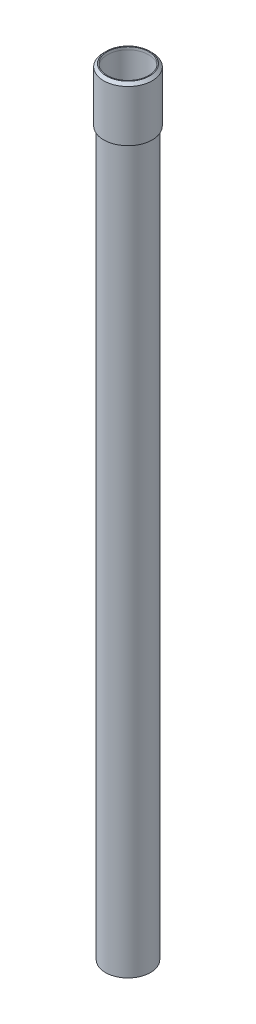
ISO-10303-21;
HEADER;
FILE_DESCRIPTION(('STEP AP214'),'2;1');
FILE_NAME('part.step','',(''),(''),'','','');
FILE_SCHEMA(('AUTOMOTIVE_DESIGN { 1 0 10303 214 1 1 1 1 }'));
ENDSEC;
DATA;
#1=APPLICATION_CONTEXT('core data for automotive mechanical design processes');
#2=APPLICATION_PROTOCOL_DEFINITION('international standard','automotive_design',2000,#1);
#3=PRODUCT_CONTEXT('',#1,'mechanical');
#4=PRODUCT('Part','Part','',(#3));
#5=PRODUCT_RELATED_PRODUCT_CATEGORY('part','',(#4));
#6=PRODUCT_DEFINITION_FORMATION('','',#4);
#7=PRODUCT_DEFINITION_CONTEXT('part definition',#1,'design');
#8=PRODUCT_DEFINITION('design','',#6,#7);
#9=PRODUCT_DEFINITION_SHAPE('','',#8);
#10=(LENGTH_UNIT() NAMED_UNIT(*) SI_UNIT(.MILLI.,.METRE.));
#11=(NAMED_UNIT(*) PLANE_ANGLE_UNIT() SI_UNIT($,.RADIAN.));
#12=(NAMED_UNIT(*) SI_UNIT($,.STERADIAN.) SOLID_ANGLE_UNIT());
#13=UNCERTAINTY_MEASURE_WITH_UNIT(LENGTH_MEASURE(1.E-05),#10,'distance_accuracy_value','');
#14=(GEOMETRIC_REPRESENTATION_CONTEXT(3) GLOBAL_UNCERTAINTY_ASSIGNED_CONTEXT((#13)) GLOBAL_UNIT_ASSIGNED_CONTEXT((#10,
#11,#12)) REPRESENTATION_CONTEXT('',''));
#15=CARTESIAN_POINT('',(0.,0.,0.));
#16=DIRECTION('',(0.,0.,1.));
#17=DIRECTION('',(1.,0.,0.));
#18=AXIS2_PLACEMENT_3D('',#15,#16,#17);
#19=CARTESIAN_POINT('',(0.,224.324804611186,0.));
#20=DIRECTION('',(0.,1.,0.));
#21=DIRECTION('',(0.,0.,1.));
#22=AXIS2_PLACEMENT_3D('',#19,#20,#21);
#23=CYLINDRICAL_SURFACE('',#22,12.5);
#24=CARTESIAN_POINT('',(0.,186.5,0.));
#25=DIRECTION('',(0.,1.,0.));
#26=DIRECTION('',(0.,0.,1.));
#27=AXIS2_PLACEMENT_3D('',#24,#25,#26);
#28=CIRCLE('',#27,12.5);
#29=CARTESIAN_POINT('',(0.,186.5,12.5));
#30=VERTEX_POINT('',#29);
#31=EDGE_CURVE('E52',#30,#30,#28,.T.);
#32=ORIENTED_EDGE('',*,*,#31,.F.);
#33=EDGE_LOOP('',(#32));
#34=FACE_BOUND('',#33,.T.);
#35=CARTESIAN_POINT('',(0.,215.,0.));
#36=DIRECTION('',(0.,1.,0.));
#37=DIRECTION('',(0.,0.,1.));
#38=AXIS2_PLACEMENT_3D('',#35,#36,#37);
#39=CIRCLE('',#38,12.5);
#40=CARTESIAN_POINT('',(0.,215.,12.5));
#41=VERTEX_POINT('',#40);
#42=EDGE_CURVE('E67',#41,#41,#39,.T.);
#43=ORIENTED_EDGE('',*,*,#42,.T.);
#44=EDGE_LOOP('',(#43));
#45=FACE_BOUND('',#44,.T.);
#46=ADVANCED_FACE('F41',(#34,#45),#23,.F.);
#47=CARTESIAN_POINT('',(13.5,186.5,0.));
#48=DIRECTION('',(0.,1.,0.));
#49=DIRECTION('',(0.,0.,1.));
#50=AXIS2_PLACEMENT_3D('',#47,#48,#49);
#51=PLANE('',#50);
#52=CARTESIAN_POINT('',(0.,186.5,0.));
#53=DIRECTION('',(0.,1.,0.));
#54=DIRECTION('',(0.,0.,1.));
#55=AXIS2_PLACEMENT_3D('',#52,#53,#54);
#56=CIRCLE('',#55,13.5);
#57=CARTESIAN_POINT('',(0.,186.5,13.5));
#58=VERTEX_POINT('',#57);
#59=EDGE_CURVE('E56',#58,#58,#56,.T.);
#60=ORIENTED_EDGE('',*,*,#59,.F.);
#61=EDGE_LOOP('',(#60));
#62=FACE_BOUND('',#61,.T.);
#63=ORIENTED_EDGE('',*,*,#31,.T.);
#64=EDGE_LOOP('',(#63));
#65=FACE_BOUND('',#64,.T.);
#66=ADVANCED_FACE('F91',(#62,#65),#51,.F.);
#67=CARTESIAN_POINT('',(0.,224.324804611186,0.));
#68=DIRECTION('',(0.,1.,0.));
#69=DIRECTION('',(0.,0.,1.));
#70=AXIS2_PLACEMENT_3D('',#67,#68,#69);
#71=CYLINDRICAL_SURFACE('',#70,13.5);
#72=CARTESIAN_POINT('',(0.,215.,0.));
#73=DIRECTION('',(0.,-1.,0.));
#74=DIRECTION('',(0.,0.,-1.));
#75=AXIS2_PLACEMENT_3D('',#72,#73,#74);
#76=CIRCLE('',#75,13.5);
#77=CARTESIAN_POINT('',(0.,215.,-13.5));
#78=VERTEX_POINT('',#77);
#79=EDGE_CURVE('E11',#78,#78,#76,.T.);
#80=ORIENTED_EDGE('',*,*,#79,.T.);
#81=EDGE_LOOP('',(#80));
#82=FACE_BOUND('',#81,.T.);
#83=ORIENTED_EDGE('',*,*,#59,.T.);
#84=EDGE_LOOP('',(#83));
#85=FACE_BOUND('',#84,.T.);
#86=ADVANCED_FACE('F86',(#82,#85),#71,.T.);
#87=CARTESIAN_POINT('',(13.5,216.5,0.));
#88=DIRECTION('',(0.,-1.,0.));
#89=DIRECTION('',(0.,0.,-1.));
#90=AXIS2_PLACEMENT_3D('',#87,#88,#89);
#91=PLANE('',#90);
#92=CARTESIAN_POINT('',(0.,216.5,0.));
#93=DIRECTION('',(0.,-1.,0.));
#94=DIRECTION('',(0.,0.,-1.));
#95=AXIS2_PLACEMENT_3D('',#92,#93,#94);
#96=CIRCLE('',#95,12.);
#97=CARTESIAN_POINT('',(0.,216.5,-12.));
#98=VERTEX_POINT('',#97);
#99=EDGE_CURVE('E48',#98,#98,#96,.F.);
#100=ORIENTED_EDGE('',*,*,#99,.T.);
#101=EDGE_LOOP('',(#100));
#102=FACE_BOUND('',#101,.T.);
#103=CARTESIAN_POINT('',(0.,216.5,0.));
#104=DIRECTION('',(0.,1.,0.));
#105=DIRECTION('',(0.,0.,1.));
#106=AXIS2_PLACEMENT_3D('',#103,#104,#105);
#107=CIRCLE('',#106,11.5);
#108=CARTESIAN_POINT('',(0.,216.5,11.5));
#109=VERTEX_POINT('',#108);
#110=EDGE_CURVE('E61',#109,#109,#107,.T.);
#111=ORIENTED_EDGE('',*,*,#110,.F.);
#112=EDGE_LOOP('',(#111));
#113=FACE_BOUND('',#112,.T.);
#114=ADVANCED_FACE('F81',(#102,#113),#91,.F.);
#115=CARTESIAN_POINT('',(0.,224.324804611186,0.));
#116=DIRECTION('',(0.,1.,0.));
#117=DIRECTION('',(0.,0.,1.));
#118=AXIS2_PLACEMENT_3D('',#115,#116,#117);
#119=CYLINDRICAL_SURFACE('',#118,11.5);
#120=CARTESIAN_POINT('',(0.,215.,0.));
#121=DIRECTION('',(0.,1.,0.));
#122=DIRECTION('',(0.,0.,1.));
#123=AXIS2_PLACEMENT_3D('',#120,#121,#122);
#124=CIRCLE('',#123,11.5);
#125=CARTESIAN_POINT('',(0.,215.,11.5));
#126=VERTEX_POINT('',#125);
#127=EDGE_CURVE('E64',#126,#126,#124,.T.);
#128=ORIENTED_EDGE('',*,*,#127,.F.);
#129=EDGE_LOOP('',(#128));
#130=FACE_BOUND('',#129,.T.);
#131=ORIENTED_EDGE('',*,*,#110,.T.);
#132=EDGE_LOOP('',(#131));
#133=FACE_BOUND('',#132,.T.);
#134=ADVANCED_FACE('F75',(#130,#133),#119,.F.);
#135=CARTESIAN_POINT('',(12.5,215.,0.));
#136=DIRECTION('',(0.,1.,0.));
#137=DIRECTION('',(0.,0.,1.));
#138=AXIS2_PLACEMENT_3D('',#135,#136,#137);
#139=PLANE('',#138);
#140=ORIENTED_EDGE('',*,*,#42,.F.);
#141=EDGE_LOOP('',(#140));
#142=FACE_BOUND('',#141,.T.);
#143=ORIENTED_EDGE('',*,*,#127,.T.);
#144=EDGE_LOOP('',(#143));
#145=FACE_BOUND('',#144,.T.);
#146=ADVANCED_FACE('F72',(#142,#145),#139,.F.);
#147=CARTESIAN_POINT('',(0.,216.5,0.));
#148=DIRECTION('',(0.,-1.,0.));
#149=DIRECTION('',(0.,0.,-1.));
#150=AXIS2_PLACEMENT_3D('',#147,#148,#149);
#151=CONICAL_SURFACE('',#150,12.,0.785398163397452);
#152=ORIENTED_EDGE('',*,*,#79,.F.);
#153=EDGE_LOOP('',(#152));
#154=FACE_BOUND('',#153,.T.);
#155=ORIENTED_EDGE('',*,*,#99,.F.);
#156=EDGE_LOOP('',(#155));
#157=FACE_BOUND('',#156,.T.);
#158=ADVANCED_FACE('F43',(#154,#157),#151,.T.);
#159=CLOSED_SHELL('',(#46,#66,#86,#114,#134,#146,#158));
#160=MANIFOLD_SOLID_BREP('B2',#159);
#161=CARTESIAN_POINT('',(0.,215.,0.));
#162=DIRECTION('',(0.,1.,0.));
#163=DIRECTION('',(0.,0.,1.));
#164=AXIS2_PLACEMENT_3D('',#161,#162,#163);
#165=PLANE('',#164);
#166=CARTESIAN_POINT('',(0.,215.,0.));
#167=DIRECTION('',(0.,1.,0.));
#168=DIRECTION('',(0.,0.,1.));
#169=AXIS2_PLACEMENT_3D('',#166,#167,#168);
#170=CIRCLE('',#169,12.5);
#171=CARTESIAN_POINT('',(0.,215.,12.5));
#172=VERTEX_POINT('',#171);
#173=EDGE_CURVE('E40',#172,#172,#170,.T.);
#174=ORIENTED_EDGE('',*,*,#173,.T.);
#175=EDGE_LOOP('',(#174));
#176=FACE_BOUND('',#175,.T.);
#177=CARTESIAN_POINT('',(0.,215.,0.));
#178=DIRECTION('',(0.,1.,0.));
#179=DIRECTION('',(0.,0.,1.));
#180=AXIS2_PLACEMENT_3D('',#177,#178,#179);
#181=CIRCLE('',#180,11.5);
#182=CARTESIAN_POINT('',(0.,215.,11.5));
#183=VERTEX_POINT('',#182);
#184=EDGE_CURVE('E159',#183,#183,#181,.T.);
#185=ORIENTED_EDGE('',*,*,#184,.F.);
#186=EDGE_LOOP('',(#185));
#187=FACE_BOUND('',#186,.T.);
#188=ADVANCED_FACE('F148',(#176,#187),#165,.T.);
#189=CARTESIAN_POINT('',(0.,-215.,0.));
#190=DIRECTION('',(0.,1.,0.));
#191=DIRECTION('',(0.,0.,1.));
#192=AXIS2_PLACEMENT_3D('',#189,#190,#191);
#193=PLANE('',#192);
#194=CARTESIAN_POINT('',(0.,-215.,0.));
#195=DIRECTION('',(0.,1.,0.));
#196=DIRECTION('',(0.,0.,1.));
#197=AXIS2_PLACEMENT_3D('',#194,#195,#196);
#198=CIRCLE('',#197,12.5);
#199=CARTESIAN_POINT('',(0.,-215.,12.5));
#200=VERTEX_POINT('',#199);
#201=EDGE_CURVE('E152',#200,#200,#198,.T.);
#202=ORIENTED_EDGE('',*,*,#201,.F.);
#203=EDGE_LOOP('',(#202));
#204=FACE_BOUND('',#203,.T.);
#205=CARTESIAN_POINT('',(0.,-215.,0.));
#206=DIRECTION('',(0.,1.,0.));
#207=DIRECTION('',(0.,0.,1.));
#208=AXIS2_PLACEMENT_3D('',#205,#206,#207);
#209=CIRCLE('',#208,11.5);
#210=CARTESIAN_POINT('',(0.,-215.,11.5));
#211=VERTEX_POINT('',#210);
#212=EDGE_CURVE('E161',#211,#211,#209,.T.);
#213=ORIENTED_EDGE('',*,*,#212,.T.);
#214=EDGE_LOOP('',(#213));
#215=FACE_BOUND('',#214,.T.);
#216=ADVANCED_FACE('F171',(#204,#215),#193,.F.);
#217=CARTESIAN_POINT('',(0.,215.,0.));
#218=DIRECTION('',(0.,-1.,0.));
#219=DIRECTION('',(0.,0.,-1.));
#220=AXIS2_PLACEMENT_3D('',#217,#218,#219);
#221=CYLINDRICAL_SURFACE('',#220,12.5);
#222=ORIENTED_EDGE('',*,*,#173,.F.);
#223=EDGE_LOOP('',(#222));
#224=FACE_BOUND('',#223,.T.);
#225=ORIENTED_EDGE('',*,*,#201,.T.);
#226=EDGE_LOOP('',(#225));
#227=FACE_BOUND('',#226,.T.);
#228=ADVANCED_FACE('F150',(#224,#227),#221,.T.);
#229=CARTESIAN_POINT('',(0.,215.,0.));
#230=DIRECTION('',(0.,-1.,0.));
#231=DIRECTION('',(0.,0.,-1.));
#232=AXIS2_PLACEMENT_3D('',#229,#230,#231);
#233=CYLINDRICAL_SURFACE('',#232,11.5);
#234=ORIENTED_EDGE('',*,*,#184,.T.);
#235=EDGE_LOOP('',(#234));
#236=FACE_BOUND('',#235,.T.);
#237=ORIENTED_EDGE('',*,*,#212,.F.);
#238=EDGE_LOOP('',(#237));
#239=FACE_BOUND('',#238,.T.);
#240=ADVANCED_FACE('F167',(#236,#239),#233,.F.);
#241=CLOSED_SHELL('',(#188,#216,#228,#240));
#242=MANIFOLD_SOLID_BREP('B6',#241);
#243=ADVANCED_BREP_SHAPE_REPRESENTATION('',(#18,#160,#242),#14);
#244=SHAPE_DEFINITION_REPRESENTATION(#9,#243);
ENDSEC;
END-ISO-10303-21;
